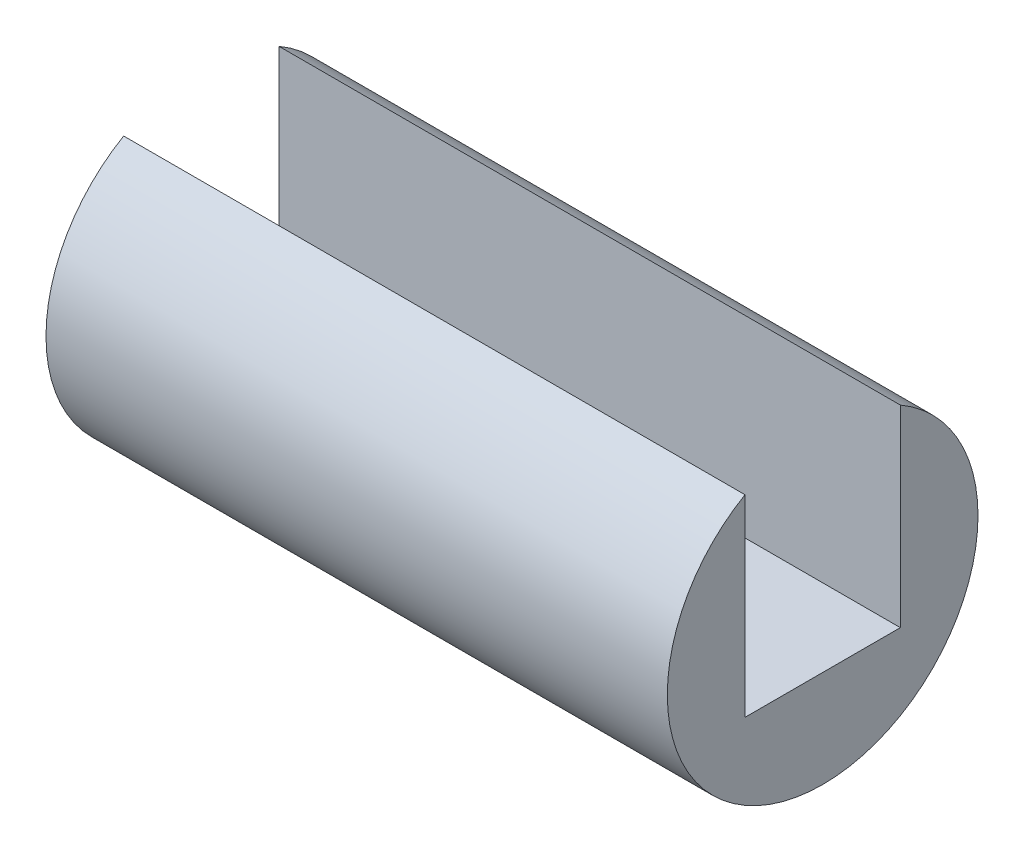
ISO-10303-21;
HEADER;
FILE_DESCRIPTION(('STEP AP214'),'2;1');
FILE_NAME('part.step','',(''),(''),'','','');
FILE_SCHEMA(('AUTOMOTIVE_DESIGN { 1 0 10303 214 1 1 1 1 }'));
ENDSEC;
DATA;
#1=APPLICATION_CONTEXT('core data for automotive mechanical design processes');
#2=APPLICATION_PROTOCOL_DEFINITION('international standard','automotive_design',2000,#1);
#3=PRODUCT_CONTEXT('',#1,'mechanical');
#4=PRODUCT('Part','Part','',(#3));
#5=PRODUCT_RELATED_PRODUCT_CATEGORY('part','',(#4));
#6=PRODUCT_DEFINITION_FORMATION('','',#4);
#7=PRODUCT_DEFINITION_CONTEXT('part definition',#1,'design');
#8=PRODUCT_DEFINITION('design','',#6,#7);
#9=PRODUCT_DEFINITION_SHAPE('','',#8);
#10=(LENGTH_UNIT() NAMED_UNIT(*) SI_UNIT(.MILLI.,.METRE.));
#11=(NAMED_UNIT(*) PLANE_ANGLE_UNIT() SI_UNIT($,.RADIAN.));
#12=(NAMED_UNIT(*) SI_UNIT($,.STERADIAN.) SOLID_ANGLE_UNIT());
#13=UNCERTAINTY_MEASURE_WITH_UNIT(LENGTH_MEASURE(1.E-05),#10,'distance_accuracy_value','');
#14=(GEOMETRIC_REPRESENTATION_CONTEXT(3) GLOBAL_UNCERTAINTY_ASSIGNED_CONTEXT((#13)) GLOBAL_UNIT_ASSIGNED_CONTEXT((#10,
#11,#12)) REPRESENTATION_CONTEXT('',''));
#15=CARTESIAN_POINT('',(0.,0.,0.));
#16=DIRECTION('',(0.,0.,1.));
#17=DIRECTION('',(1.,0.,0.));
#18=AXIS2_PLACEMENT_3D('',#15,#16,#17);
#19=CARTESIAN_POINT('',(25.4,10.2617613140312,-3.175));
#20=DIRECTION('',(0.,0.,-1.));
#21=DIRECTION('',(-1.,0.,0.));
#22=AXIS2_PLACEMENT_3D('',#19,#20,#21);
#23=PLANE('',#22);
#24=DIRECTION('',(0.,-1.,0.));
#25=VECTOR('',#24,1.);
#26=CARTESIAN_POINT('',(0.,10.2617613140312,-3.175));
#27=LINE('',#26,#25);
#28=CARTESIAN_POINT('',(0.,10.2617613140312,-3.175));
#29=VERTEX_POINT('',#28);
#30=CARTESIAN_POINT('',(0.,2.38125,-3.175));
#31=VERTEX_POINT('',#30);
#32=EDGE_CURVE('E96',#29,#31,#27,.T.);
#33=ORIENTED_EDGE('',*,*,#32,.T.);
#34=DIRECTION('',(-1.,0.,0.));
#35=VECTOR('',#34,1.);
#36=CARTESIAN_POINT('',(25.4,2.38125,-3.175));
#37=LINE('',#36,#35);
#38=CARTESIAN_POINT('',(25.4,2.38125,-3.175));
#39=VERTEX_POINT('',#38);
#40=EDGE_CURVE('E11',#39,#31,#37,.T.);
#41=ORIENTED_EDGE('',*,*,#40,.F.);
#42=DIRECTION('',(0.,-1.,0.));
#43=VECTOR('',#42,1.);
#44=CARTESIAN_POINT('',(25.4,10.2617613140312,-3.175));
#45=LINE('',#44,#43);
#46=CARTESIAN_POINT('',(25.4,10.2617613140312,-3.175));
#47=VERTEX_POINT('',#46);
#48=EDGE_CURVE('E84',#47,#39,#45,.T.);
#49=ORIENTED_EDGE('',*,*,#48,.F.);
#50=DIRECTION('',(-1.,0.,0.));
#51=VECTOR('',#50,1.);
#52=CARTESIAN_POINT('',(25.4,10.2617613140312,-3.175));
#53=LINE('',#52,#51);
#54=EDGE_CURVE('E92',#47,#29,#53,.T.);
#55=ORIENTED_EDGE('',*,*,#54,.T.);
#56=EDGE_LOOP('',(#33,#41,#49,#55));
#57=FACE_BOUND('',#56,.T.);
#58=ADVANCED_FACE('F33',(#57),#23,.F.);
#59=CARTESIAN_POINT('',(25.4,2.38125,-3.175));
#60=DIRECTION('',(0.,-1.,0.));
#61=DIRECTION('',(0.,0.,-1.));
#62=AXIS2_PLACEMENT_3D('',#59,#60,#61);
#63=PLANE('',#62);
#64=DIRECTION('',(0.,0.,1.));
#65=VECTOR('',#64,1.);
#66=CARTESIAN_POINT('',(0.,2.38125,-3.175));
#67=LINE('',#66,#65);
#68=CARTESIAN_POINT('',(0.,2.38125,3.175));
#69=VERTEX_POINT('',#68);
#70=EDGE_CURVE('E88',#31,#69,#67,.T.);
#71=ORIENTED_EDGE('',*,*,#70,.T.);
#72=DIRECTION('',(-1.,0.,0.));
#73=VECTOR('',#72,1.);
#74=CARTESIAN_POINT('',(25.4,2.38125,3.175));
#75=LINE('',#74,#73);
#76=CARTESIAN_POINT('',(25.4,2.38125,3.175));
#77=VERTEX_POINT('',#76);
#78=EDGE_CURVE('E41',#77,#69,#75,.T.);
#79=ORIENTED_EDGE('',*,*,#78,.F.);
#80=DIRECTION('',(0.,0.,1.));
#81=VECTOR('',#80,1.);
#82=CARTESIAN_POINT('',(25.4,2.38125,-3.175));
#83=LINE('',#82,#81);
#84=EDGE_CURVE('E79',#39,#77,#83,.T.);
#85=ORIENTED_EDGE('',*,*,#84,.F.);
#86=ORIENTED_EDGE('',*,*,#40,.T.);
#87=EDGE_LOOP('',(#71,#79,#85,#86));
#88=FACE_BOUND('',#87,.T.);
#89=ADVANCED_FACE('F87',(#88),#63,.F.);
#90=CARTESIAN_POINT('',(25.4,10.2617613140312,3.175));
#91=DIRECTION('',(0.,0.,1.));
#92=DIRECTION('',(1.,0.,0.));
#93=AXIS2_PLACEMENT_3D('',#90,#91,#92);
#94=PLANE('',#93);
#95=DIRECTION('',(0.,1.,0.));
#96=VECTOR('',#95,1.);
#97=CARTESIAN_POINT('',(0.,10.2617613140312,3.175));
#98=LINE('',#97,#96);
#99=CARTESIAN_POINT('',(0.,10.2617613140312,3.175));
#100=VERTEX_POINT('',#99);
#101=EDGE_CURVE('E66',#69,#100,#98,.T.);
#102=ORIENTED_EDGE('',*,*,#101,.T.);
#103=DIRECTION('',(-1.,0.,0.));
#104=VECTOR('',#103,1.);
#105=CARTESIAN_POINT('',(25.4,10.2617613140312,3.175));
#106=LINE('',#105,#104);
#107=CARTESIAN_POINT('',(25.4,10.2617613140312,3.175));
#108=VERTEX_POINT('',#107);
#109=EDGE_CURVE('E89',#108,#100,#106,.T.);
#110=ORIENTED_EDGE('',*,*,#109,.F.);
#111=DIRECTION('',(0.,1.,0.));
#112=VECTOR('',#111,1.);
#113=CARTESIAN_POINT('',(25.4,10.2617613140312,3.175));
#114=LINE('',#113,#112);
#115=EDGE_CURVE('E82',#77,#108,#114,.T.);
#116=ORIENTED_EDGE('',*,*,#115,.F.);
#117=ORIENTED_EDGE('',*,*,#78,.T.);
#118=EDGE_LOOP('',(#102,#110,#116,#117));
#119=FACE_BOUND('',#118,.T.);
#120=ADVANCED_FACE('F90',(#119),#94,.F.);
#121=CARTESIAN_POINT('',(25.4,4.7625,0.));
#122=DIRECTION('',(-1.,0.,0.));
#123=DIRECTION('',(0.,0.,1.));
#124=AXIS2_PLACEMENT_3D('',#121,#122,#123);
#125=CYLINDRICAL_SURFACE('',#124,6.35);
#126=CARTESIAN_POINT('',(0.,4.7625,0.));
#127=DIRECTION('',(1.,0.,0.));
#128=DIRECTION('',(0.,0.,1.));
#129=AXIS2_PLACEMENT_3D('',#126,#127,#128);
#130=CIRCLE('',#129,6.35);
#131=EDGE_CURVE('E72',#100,#29,#130,.T.);
#132=ORIENTED_EDGE('',*,*,#131,.T.);
#133=ORIENTED_EDGE('',*,*,#54,.F.);
#134=CARTESIAN_POINT('',(25.4,4.7625,0.));
#135=DIRECTION('',(1.,0.,0.));
#136=DIRECTION('',(0.,0.,1.));
#137=AXIS2_PLACEMENT_3D('',#134,#135,#136);
#138=CIRCLE('',#137,6.35);
#139=EDGE_CURVE('E49',#108,#47,#138,.T.);
#140=ORIENTED_EDGE('',*,*,#139,.F.);
#141=ORIENTED_EDGE('',*,*,#109,.T.);
#142=EDGE_LOOP('',(#132,#133,#140,#141));
#143=FACE_BOUND('',#142,.T.);
#144=ADVANCED_FACE('F103',(#143),#125,.T.);
#145=CARTESIAN_POINT('',(25.4,4.7625,0.));
#146=DIRECTION('',(-1.,0.,0.));
#147=DIRECTION('',(0.,0.,1.));
#148=AXIS2_PLACEMENT_3D('',#145,#146,#147);
#149=PLANE('',#148);
#150=ORIENTED_EDGE('',*,*,#48,.T.);
#151=ORIENTED_EDGE('',*,*,#84,.T.);
#152=ORIENTED_EDGE('',*,*,#115,.T.);
#153=ORIENTED_EDGE('',*,*,#139,.T.);
#154=EDGE_LOOP('',(#150,#151,#152,#153));
#155=FACE_BOUND('',#154,.T.);
#156=ADVANCED_FACE('F80',(#155),#149,.F.);
#157=CARTESIAN_POINT('',(0.,4.7625,0.));
#158=DIRECTION('',(-1.,0.,0.));
#159=DIRECTION('',(0.,0.,1.));
#160=AXIS2_PLACEMENT_3D('',#157,#158,#159);
#161=PLANE('',#160);
#162=ORIENTED_EDGE('',*,*,#32,.F.);
#163=ORIENTED_EDGE('',*,*,#131,.F.);
#164=ORIENTED_EDGE('',*,*,#101,.F.);
#165=ORIENTED_EDGE('',*,*,#70,.F.);
#166=EDGE_LOOP('',(#162,#163,#164,#165));
#167=FACE_BOUND('',#166,.T.);
#168=ADVANCED_FACE('F106',(#167),#161,.T.);
#169=CLOSED_SHELL('',(#58,#89,#120,#144,#156,#168));
#170=MANIFOLD_SOLID_BREP('B2',#169);
#171=ADVANCED_BREP_SHAPE_REPRESENTATION('',(#18,#170),#14);
#172=SHAPE_DEFINITION_REPRESENTATION(#9,#171);
ENDSEC;
END-ISO-10303-21;
